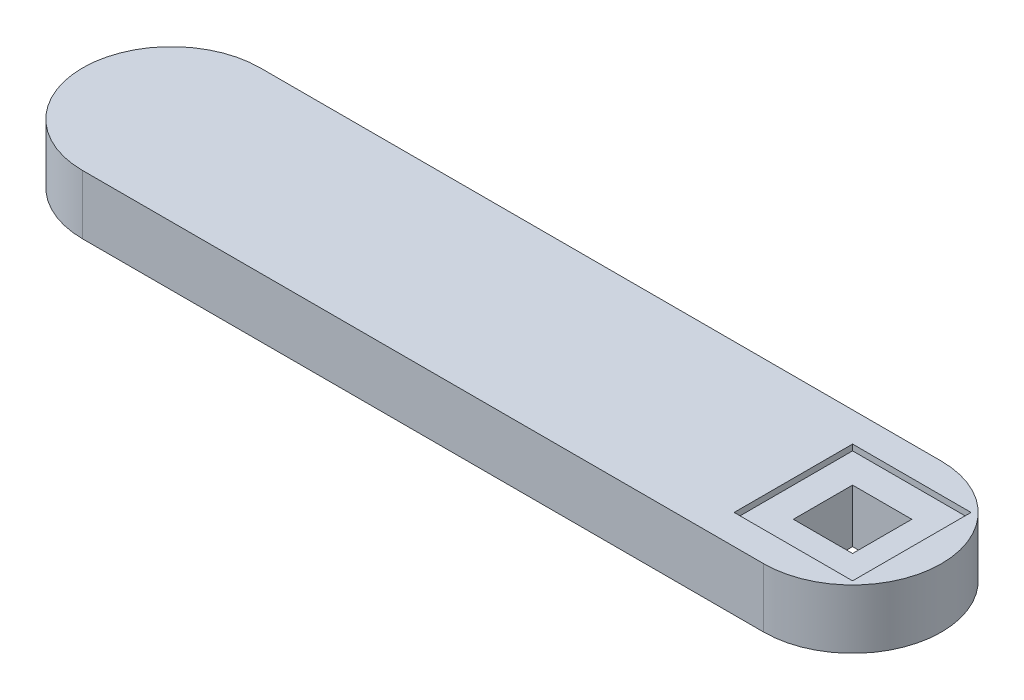
ISO-10303-21;
HEADER;
FILE_DESCRIPTION(('STEP AP214'),'2;1');
FILE_NAME('part.step','',(''),(''),'','','');
FILE_SCHEMA(('AUTOMOTIVE_DESIGN { 1 0 10303 214 1 1 1 1 }'));
ENDSEC;
DATA;
#1=APPLICATION_CONTEXT('core data for automotive mechanical design processes');
#2=APPLICATION_PROTOCOL_DEFINITION('international standard','automotive_design',2000,#1);
#3=PRODUCT_CONTEXT('',#1,'mechanical');
#4=PRODUCT('Part','Part','',(#3));
#5=PRODUCT_RELATED_PRODUCT_CATEGORY('part','',(#4));
#6=PRODUCT_DEFINITION_FORMATION('','',#4);
#7=PRODUCT_DEFINITION_CONTEXT('part definition',#1,'design');
#8=PRODUCT_DEFINITION('design','',#6,#7);
#9=PRODUCT_DEFINITION_SHAPE('','',#8);
#10=(LENGTH_UNIT() NAMED_UNIT(*) SI_UNIT(.MILLI.,.METRE.));
#11=(NAMED_UNIT(*) PLANE_ANGLE_UNIT() SI_UNIT($,.RADIAN.));
#12=(NAMED_UNIT(*) SI_UNIT($,.STERADIAN.) SOLID_ANGLE_UNIT());
#13=UNCERTAINTY_MEASURE_WITH_UNIT(LENGTH_MEASURE(1.E-05),#10,'distance_accuracy_value','');
#14=(GEOMETRIC_REPRESENTATION_CONTEXT(3) GLOBAL_UNCERTAINTY_ASSIGNED_CONTEXT((#13)) GLOBAL_UNIT_ASSIGNED_CONTEXT((#10,
#11,#12)) REPRESENTATION_CONTEXT('',''));
#15=CARTESIAN_POINT('',(0.,0.,0.));
#16=DIRECTION('',(0.,0.,1.));
#17=DIRECTION('',(1.,0.,0.));
#18=AXIS2_PLACEMENT_3D('',#15,#16,#17);
#19=CARTESIAN_POINT('',(1200.,0.,-50.));
#20=DIRECTION('',(1.,0.,0.));
#21=DIRECTION('',(0.,0.,-1.));
#22=AXIS2_PLACEMENT_3D('',#19,#20,#21);
#23=PLANE('',#22);
#24=DIRECTION('',(0.,0.,1.));
#25=VECTOR('',#24,1.);
#26=CARTESIAN_POINT('',(1200.,90.,-50.));
#27=LINE('',#26,#25);
#28=CARTESIAN_POINT('',(1200.,90.,-50.));
#29=VERTEX_POINT('',#28);
#30=CARTESIAN_POINT('',(1200.,90.,50.));
#31=VERTEX_POINT('',#30);
#32=EDGE_CURVE('E163',#29,#31,#27,.T.);
#33=ORIENTED_EDGE('',*,*,#32,.F.);
#34=DIRECTION('',(0.,1.,0.));
#35=VECTOR('',#34,1.);
#36=CARTESIAN_POINT('',(1200.,0.,-50.));
#37=LINE('',#36,#35);
#38=CARTESIAN_POINT('',(1200.,0.,-50.));
#39=VERTEX_POINT('',#38);
#40=EDGE_CURVE('E177',#39,#29,#37,.T.);
#41=ORIENTED_EDGE('',*,*,#40,.F.);
#42=DIRECTION('',(0.,0.,-1.));
#43=VECTOR('',#42,1.);
#44=CARTESIAN_POINT('',(1200.,0.,-50.));
#45=LINE('',#44,#43);
#46=CARTESIAN_POINT('',(1200.,0.,50.));
#47=VERTEX_POINT('',#46);
#48=EDGE_CURVE('E165',#47,#39,#45,.T.);
#49=ORIENTED_EDGE('',*,*,#48,.F.);
#50=DIRECTION('',(0.,1.,0.));
#51=VECTOR('',#50,1.);
#52=CARTESIAN_POINT('',(1200.,0.,50.));
#53=LINE('',#52,#51);
#54=EDGE_CURVE('E178',#47,#31,#53,.T.);
#55=ORIENTED_EDGE('',*,*,#54,.T.);
#56=EDGE_LOOP('',(#33,#41,#49,#55));
#57=FACE_BOUND('',#56,.T.);
#58=ADVANCED_FACE('F34',(#57),#23,.F.);
#59=CARTESIAN_POINT('',(1100.,0.,50.));
#60=DIRECTION('',(0.,0.,1.));
#61=DIRECTION('',(1.,0.,0.));
#62=AXIS2_PLACEMENT_3D('',#59,#60,#61);
#63=PLANE('',#62);
#64=DIRECTION('',(-1.,0.,0.));
#65=VECTOR('',#64,1.);
#66=CARTESIAN_POINT('',(1100.,90.,50.));
#67=LINE('',#66,#65);
#68=CARTESIAN_POINT('',(1100.,90.,50.));
#69=VERTEX_POINT('',#68);
#70=EDGE_CURVE('E161',#31,#69,#67,.T.);
#71=ORIENTED_EDGE('',*,*,#70,.F.);
#72=ORIENTED_EDGE('',*,*,#54,.F.);
#73=DIRECTION('',(1.,0.,0.));
#74=VECTOR('',#73,1.);
#75=CARTESIAN_POINT('',(1100.,0.,50.));
#76=LINE('',#75,#74);
#77=CARTESIAN_POINT('',(1100.,0.,50.));
#78=VERTEX_POINT('',#77);
#79=EDGE_CURVE('E174',#78,#47,#76,.T.);
#80=ORIENTED_EDGE('',*,*,#79,.F.);
#81=DIRECTION('',(0.,1.,0.));
#82=VECTOR('',#81,1.);
#83=CARTESIAN_POINT('',(1100.,0.,50.));
#84=LINE('',#83,#82);
#85=EDGE_CURVE('E182',#78,#69,#84,.T.);
#86=ORIENTED_EDGE('',*,*,#85,.T.);
#87=EDGE_LOOP('',(#71,#72,#80,#86));
#88=FACE_BOUND('',#87,.T.);
#89=ADVANCED_FACE('F261',(#88),#63,.F.);
#90=CARTESIAN_POINT('',(1100.,0.,-50.));
#91=DIRECTION('',(-1.,0.,0.));
#92=DIRECTION('',(0.,0.,1.));
#93=AXIS2_PLACEMENT_3D('',#90,#91,#92);
#94=PLANE('',#93);
#95=DIRECTION('',(0.,0.,-1.));
#96=VECTOR('',#95,1.);
#97=CARTESIAN_POINT('',(1100.,90.,-50.));
#98=LINE('',#97,#96);
#99=CARTESIAN_POINT('',(1100.,90.,-50.));
#100=VERTEX_POINT('',#99);
#101=EDGE_CURVE('E56',#69,#100,#98,.T.);
#102=ORIENTED_EDGE('',*,*,#101,.F.);
#103=ORIENTED_EDGE('',*,*,#85,.F.);
#104=DIRECTION('',(0.,0.,1.));
#105=VECTOR('',#104,1.);
#106=CARTESIAN_POINT('',(1100.,0.,-50.));
#107=LINE('',#106,#105);
#108=CARTESIAN_POINT('',(1100.,0.,-50.));
#109=VERTEX_POINT('',#108);
#110=EDGE_CURVE('E171',#109,#78,#107,.T.);
#111=ORIENTED_EDGE('',*,*,#110,.F.);
#112=DIRECTION('',(0.,1.,0.));
#113=VECTOR('',#112,1.);
#114=CARTESIAN_POINT('',(1100.,0.,-50.));
#115=LINE('',#114,#113);
#116=EDGE_CURVE('E185',#109,#100,#115,.T.);
#117=ORIENTED_EDGE('',*,*,#116,.T.);
#118=EDGE_LOOP('',(#102,#103,#111,#117));
#119=FACE_BOUND('',#118,.T.);
#120=ADVANCED_FACE('F268',(#119),#94,.F.);
#121=CARTESIAN_POINT('',(1100.,0.,-50.));
#122=DIRECTION('',(0.,0.,-1.));
#123=DIRECTION('',(-1.,0.,0.));
#124=AXIS2_PLACEMENT_3D('',#121,#122,#123);
#125=PLANE('',#124);
#126=DIRECTION('',(1.,0.,0.));
#127=VECTOR('',#126,1.);
#128=CARTESIAN_POINT('',(1100.,90.,-50.));
#129=LINE('',#128,#127);
#130=EDGE_CURVE('E11',#100,#29,#129,.T.);
#131=ORIENTED_EDGE('',*,*,#130,.F.);
#132=ORIENTED_EDGE('',*,*,#116,.F.);
#133=DIRECTION('',(-1.,0.,0.));
#134=VECTOR('',#133,1.);
#135=CARTESIAN_POINT('',(1100.,0.,-50.));
#136=LINE('',#135,#134);
#137=EDGE_CURVE('E168',#39,#109,#136,.T.);
#138=ORIENTED_EDGE('',*,*,#137,.F.);
#139=ORIENTED_EDGE('',*,*,#40,.T.);
#140=EDGE_LOOP('',(#131,#132,#138,#139));
#141=FACE_BOUND('',#140,.T.);
#142=ADVANCED_FACE('F274',(#141),#125,.F.);
#143=CARTESIAN_POINT('',(0.,100.,0.));
#144=DIRECTION('',(0.,-1.,0.));
#145=DIRECTION('',(0.,0.,-1.));
#146=AXIS2_PLACEMENT_3D('',#143,#144,#145);
#147=CYLINDRICAL_SURFACE('',#146,150.);
#148=CARTESIAN_POINT('',(0.,0.,0.));
#149=DIRECTION('',(0.,1.,0.));
#150=DIRECTION('',(0.,0.,1.));
#151=AXIS2_PLACEMENT_3D('',#148,#149,#150);
#152=CIRCLE('',#151,150.);
#153=CARTESIAN_POINT('',(0.,0.,-150.));
#154=VERTEX_POINT('',#153);
#155=CARTESIAN_POINT('',(0.,0.,150.));
#156=VERTEX_POINT('',#155);
#157=EDGE_CURVE('E192',#154,#156,#152,.T.);
#158=ORIENTED_EDGE('',*,*,#157,.T.);
#159=DIRECTION('',(0.,-1.,0.));
#160=VECTOR('',#159,1.);
#161=CARTESIAN_POINT('',(0.,100.,150.));
#162=LINE('',#161,#160);
#163=CARTESIAN_POINT('',(0.,100.,150.));
#164=VERTEX_POINT('',#163);
#165=EDGE_CURVE('E219',#164,#156,#162,.T.);
#166=ORIENTED_EDGE('',*,*,#165,.F.);
#167=CARTESIAN_POINT('',(0.,100.,0.));
#168=DIRECTION('',(0.,1.,0.));
#169=DIRECTION('',(0.,0.,1.));
#170=AXIS2_PLACEMENT_3D('',#167,#168,#169);
#171=CIRCLE('',#170,150.);
#172=CARTESIAN_POINT('',(0.,100.,-150.));
#173=VERTEX_POINT('',#172);
#174=EDGE_CURVE('E193',#173,#164,#171,.T.);
#175=ORIENTED_EDGE('',*,*,#174,.F.);
#176=DIRECTION('',(0.,-1.,0.));
#177=VECTOR('',#176,1.);
#178=CARTESIAN_POINT('',(0.,100.,-150.));
#179=LINE('',#178,#177);
#180=EDGE_CURVE('E203',#173,#154,#179,.T.);
#181=ORIENTED_EDGE('',*,*,#180,.T.);
#182=EDGE_LOOP('',(#158,#166,#175,#181));
#183=FACE_BOUND('',#182,.T.);
#184=ADVANCED_FACE('F36',(#183),#147,.T.);
#185=CARTESIAN_POINT('',(0.,100.,150.));
#186=DIRECTION('',(0.,0.,-1.));
#187=DIRECTION('',(-1.,0.,0.));
#188=AXIS2_PLACEMENT_3D('',#185,#186,#187);
#189=PLANE('',#188);
#190=DIRECTION('',(1.,0.,0.));
#191=VECTOR('',#190,1.);
#192=CARTESIAN_POINT('',(0.,0.,150.));
#193=LINE('',#192,#191);
#194=CARTESIAN_POINT('',(1150.,0.,150.));
#195=VERTEX_POINT('',#194);
#196=EDGE_CURVE('E206',#156,#195,#193,.T.);
#197=ORIENTED_EDGE('',*,*,#196,.T.);
#198=DIRECTION('',(0.,-1.,0.));
#199=VECTOR('',#198,1.);
#200=CARTESIAN_POINT('',(1150.,100.,150.));
#201=LINE('',#200,#199);
#202=CARTESIAN_POINT('',(1150.,100.,150.));
#203=VERTEX_POINT('',#202);
#204=EDGE_CURVE('E216',#203,#195,#201,.T.);
#205=ORIENTED_EDGE('',*,*,#204,.F.);
#206=DIRECTION('',(1.,0.,0.));
#207=VECTOR('',#206,1.);
#208=CARTESIAN_POINT('',(0.,100.,150.));
#209=LINE('',#208,#207);
#210=EDGE_CURVE('E196',#164,#203,#209,.T.);
#211=ORIENTED_EDGE('',*,*,#210,.F.);
#212=ORIENTED_EDGE('',*,*,#165,.T.);
#213=EDGE_LOOP('',(#197,#205,#211,#212));
#214=FACE_BOUND('',#213,.T.);
#215=ADVANCED_FACE('F248',(#214),#189,.F.);
#216=CARTESIAN_POINT('',(1150.,100.,0.));
#217=DIRECTION('',(0.,-1.,0.));
#218=DIRECTION('',(0.,0.,-1.));
#219=AXIS2_PLACEMENT_3D('',#216,#217,#218);
#220=CYLINDRICAL_SURFACE('',#219,150.);
#221=CARTESIAN_POINT('',(1150.,0.,0.));
#222=DIRECTION('',(0.,1.,0.));
#223=DIRECTION('',(0.,0.,1.));
#224=AXIS2_PLACEMENT_3D('',#221,#222,#223);
#225=CIRCLE('',#224,150.);
#226=CARTESIAN_POINT('',(1150.,0.,-150.));
#227=VERTEX_POINT('',#226);
#228=EDGE_CURVE('E208',#195,#227,#225,.T.);
#229=ORIENTED_EDGE('',*,*,#228,.T.);
#230=DIRECTION('',(0.,-1.,0.));
#231=VECTOR('',#230,1.);
#232=CARTESIAN_POINT('',(1150.,100.,-150.));
#233=LINE('',#232,#231);
#234=CARTESIAN_POINT('',(1150.,100.,-150.));
#235=VERTEX_POINT('',#234);
#236=EDGE_CURVE('E213',#235,#227,#233,.T.);
#237=ORIENTED_EDGE('',*,*,#236,.F.);
#238=CARTESIAN_POINT('',(1150.,100.,0.));
#239=DIRECTION('',(0.,1.,0.));
#240=DIRECTION('',(0.,0.,1.));
#241=AXIS2_PLACEMENT_3D('',#238,#239,#240);
#242=CIRCLE('',#241,150.);
#243=EDGE_CURVE('E199',#203,#235,#242,.T.);
#244=ORIENTED_EDGE('',*,*,#243,.F.);
#245=ORIENTED_EDGE('',*,*,#204,.T.);
#246=EDGE_LOOP('',(#229,#237,#244,#245));
#247=FACE_BOUND('',#246,.T.);
#248=ADVANCED_FACE('F245',(#247),#220,.T.);
#249=CARTESIAN_POINT('',(0.,100.,-150.));
#250=DIRECTION('',(0.,0.,1.));
#251=DIRECTION('',(1.,0.,0.));
#252=AXIS2_PLACEMENT_3D('',#249,#250,#251);
#253=PLANE('',#252);
#254=DIRECTION('',(-1.,0.,0.));
#255=VECTOR('',#254,1.);
#256=CARTESIAN_POINT('',(0.,0.,-150.));
#257=LINE('',#256,#255);
#258=EDGE_CURVE('E197',#227,#154,#257,.T.);
#259=ORIENTED_EDGE('',*,*,#258,.T.);
#260=ORIENTED_EDGE('',*,*,#180,.F.);
#261=DIRECTION('',(-1.,0.,0.));
#262=VECTOR('',#261,1.);
#263=CARTESIAN_POINT('',(0.,100.,-150.));
#264=LINE('',#263,#262);
#265=EDGE_CURVE('E201',#235,#173,#264,.T.);
#266=ORIENTED_EDGE('',*,*,#265,.F.);
#267=ORIENTED_EDGE('',*,*,#236,.T.);
#268=EDGE_LOOP('',(#259,#260,#266,#267));
#269=FACE_BOUND('',#268,.T.);
#270=ADVANCED_FACE('F241',(#269),#253,.F.);
#271=CARTESIAN_POINT('',(0.,100.,0.));
#272=DIRECTION('',(0.,1.,0.));
#273=DIRECTION('',(0.,0.,1.));
#274=AXIS2_PLACEMENT_3D('',#271,#272,#273);
#275=PLANE('',#274);
#276=DIRECTION('',(0.,0.,-1.));
#277=VECTOR('',#276,1.);
#278=CARTESIAN_POINT('',(1250.,100.,-99.9999999999999));
#279=LINE('',#278,#277);
#280=CARTESIAN_POINT('',(1250.,100.,100.));
#281=VERTEX_POINT('',#280);
#282=CARTESIAN_POINT('',(1250.,100.,-99.9999999999999));
#283=VERTEX_POINT('',#282);
#284=EDGE_CURVE('E49',#281,#283,#279,.T.);
#285=ORIENTED_EDGE('',*,*,#284,.F.);
#286=DIRECTION('',(1.,0.,0.));
#287=VECTOR('',#286,1.);
#288=CARTESIAN_POINT('',(1050.,100.,100.));
#289=LINE('',#288,#287);
#290=CARTESIAN_POINT('',(1050.,100.,100.));
#291=VERTEX_POINT('',#290);
#292=EDGE_CURVE('E142',#291,#281,#289,.T.);
#293=ORIENTED_EDGE('',*,*,#292,.F.);
#294=DIRECTION('',(0.,0.,1.));
#295=VECTOR('',#294,1.);
#296=CARTESIAN_POINT('',(1050.,100.,-99.9999999999999));
#297=LINE('',#296,#295);
#298=CARTESIAN_POINT('',(1050.,100.,-99.9999999999999));
#299=VERTEX_POINT('',#298);
#300=EDGE_CURVE('E145',#299,#291,#297,.T.);
#301=ORIENTED_EDGE('',*,*,#300,.F.);
#302=DIRECTION('',(-1.,0.,0.));
#303=VECTOR('',#302,1.);
#304=CARTESIAN_POINT('',(1050.,100.,-99.9999999999999));
#305=LINE('',#304,#303);
#306=EDGE_CURVE('E151',#283,#299,#305,.T.);
#307=ORIENTED_EDGE('',*,*,#306,.F.);
#308=EDGE_LOOP('',(#285,#293,#301,#307));
#309=FACE_BOUND('',#308,.T.);
#310=ORIENTED_EDGE('',*,*,#174,.T.);
#311=ORIENTED_EDGE('',*,*,#210,.T.);
#312=ORIENTED_EDGE('',*,*,#243,.T.);
#313=ORIENTED_EDGE('',*,*,#265,.T.);
#314=EDGE_LOOP('',(#310,#311,#312,#313));
#315=FACE_BOUND('',#314,.T.);
#316=ADVANCED_FACE('F229',(#309,#315),#275,.T.);
#317=CARTESIAN_POINT('',(0.,0.,0.));
#318=DIRECTION('',(0.,1.,0.));
#319=DIRECTION('',(0.,0.,1.));
#320=AXIS2_PLACEMENT_3D('',#317,#318,#319);
#321=PLANE('',#320);
#322=ORIENTED_EDGE('',*,*,#79,.T.);
#323=ORIENTED_EDGE('',*,*,#48,.T.);
#324=ORIENTED_EDGE('',*,*,#137,.T.);
#325=ORIENTED_EDGE('',*,*,#110,.T.);
#326=EDGE_LOOP('',(#322,#323,#324,#325));
#327=FACE_BOUND('',#326,.T.);
#328=CARTESIAN_POINT('',(0.,0.,0.));
#329=DIRECTION('',(0.,1.,0.));
#330=DIRECTION('',(0.,0.,1.));
#331=AXIS2_PLACEMENT_3D('',#328,#329,#330);
#332=CIRCLE('',#331,50.);
#333=CARTESIAN_POINT('',(0.,0.,50.));
#334=VERTEX_POINT('',#333);
#335=EDGE_CURVE('E42',#334,#334,#332,.F.);
#336=ORIENTED_EDGE('',*,*,#335,.F.);
#337=EDGE_LOOP('',(#336));
#338=FACE_BOUND('',#337,.T.);
#339=ORIENTED_EDGE('',*,*,#157,.F.);
#340=ORIENTED_EDGE('',*,*,#258,.F.);
#341=ORIENTED_EDGE('',*,*,#228,.F.);
#342=ORIENTED_EDGE('',*,*,#196,.F.);
#343=EDGE_LOOP('',(#339,#340,#341,#342));
#344=FACE_BOUND('',#343,.T.);
#345=ADVANCED_FACE('F226',(#327,#338,#344),#321,.F.);
#346=CARTESIAN_POINT('',(0.,-50.,0.));
#347=DIRECTION('',(0.,1.,0.));
#348=DIRECTION('',(0.,0.,1.));
#349=AXIS2_PLACEMENT_3D('',#346,#347,#348);
#350=CYLINDRICAL_SURFACE('',#349,50.);
#351=CARTESIAN_POINT('',(0.,-50.,0.));
#352=DIRECTION('',(0.,-1.,0.));
#353=DIRECTION('',(0.,0.,-1.));
#354=AXIS2_PLACEMENT_3D('',#351,#352,#353);
#355=CIRCLE('',#354,50.);
#356=CARTESIAN_POINT('',(0.,-50.,-50.));
#357=VERTEX_POINT('',#356);
#358=EDGE_CURVE('E181',#357,#357,#355,.T.);
#359=ORIENTED_EDGE('',*,*,#358,.F.);
#360=EDGE_LOOP('',(#359));
#361=FACE_BOUND('',#360,.T.);
#362=ORIENTED_EDGE('',*,*,#335,.T.);
#363=EDGE_LOOP('',(#362));
#364=FACE_BOUND('',#363,.T.);
#365=ADVANCED_FACE('F224',(#361,#364),#350,.T.);
#366=CARTESIAN_POINT('',(0.,-50.,0.));
#367=DIRECTION('',(0.,-1.,0.));
#368=DIRECTION('',(0.,0.,-1.));
#369=AXIS2_PLACEMENT_3D('',#366,#367,#368);
#370=PLANE('',#369);
#371=ORIENTED_EDGE('',*,*,#358,.T.);
#372=EDGE_LOOP('',(#371));
#373=FACE_BOUND('',#372,.T.);
#374=ADVANCED_FACE('F276',(#373),#370,.T.);
#375=CARTESIAN_POINT('',(0.,90.,0.));
#376=DIRECTION('',(0.,1.,0.));
#377=DIRECTION('',(0.,0.,1.));
#378=AXIS2_PLACEMENT_3D('',#375,#376,#377);
#379=PLANE('',#378);
#380=DIRECTION('',(0.,0.,-1.));
#381=VECTOR('',#380,1.);
#382=CARTESIAN_POINT('',(1250.,90.,-99.9999999999999));
#383=LINE('',#382,#381);
#384=CARTESIAN_POINT('',(1250.,90.,100.));
#385=VERTEX_POINT('',#384);
#386=CARTESIAN_POINT('',(1250.,90.,-99.9999999999999));
#387=VERTEX_POINT('',#386);
#388=EDGE_CURVE('E124',#385,#387,#383,.T.);
#389=ORIENTED_EDGE('',*,*,#388,.T.);
#390=DIRECTION('',(-1.,0.,0.));
#391=VECTOR('',#390,1.);
#392=CARTESIAN_POINT('',(1050.,90.,-99.9999999999999));
#393=LINE('',#392,#391);
#394=CARTESIAN_POINT('',(1050.,90.,-99.9999999999999));
#395=VERTEX_POINT('',#394);
#396=EDGE_CURVE('E133',#387,#395,#393,.T.);
#397=ORIENTED_EDGE('',*,*,#396,.T.);
#398=DIRECTION('',(0.,0.,1.));
#399=VECTOR('',#398,1.);
#400=CARTESIAN_POINT('',(1050.,90.,-99.9999999999999));
#401=LINE('',#400,#399);
#402=CARTESIAN_POINT('',(1050.,90.,100.));
#403=VERTEX_POINT('',#402);
#404=EDGE_CURVE('E138',#395,#403,#401,.T.);
#405=ORIENTED_EDGE('',*,*,#404,.T.);
#406=DIRECTION('',(1.,0.,0.));
#407=VECTOR('',#406,1.);
#408=CARTESIAN_POINT('',(1050.,90.,100.));
#409=LINE('',#408,#407);
#410=EDGE_CURVE('E130',#403,#385,#409,.T.);
#411=ORIENTED_EDGE('',*,*,#410,.T.);
#412=EDGE_LOOP('',(#389,#397,#405,#411));
#413=FACE_BOUND('',#412,.T.);
#414=ORIENTED_EDGE('',*,*,#32,.T.);
#415=ORIENTED_EDGE('',*,*,#70,.T.);
#416=ORIENTED_EDGE('',*,*,#101,.T.);
#417=ORIENTED_EDGE('',*,*,#130,.T.);
#418=EDGE_LOOP('',(#414,#415,#416,#417));
#419=FACE_BOUND('',#418,.T.);
#420=ADVANCED_FACE('F140',(#413,#419),#379,.T.);
#421=CARTESIAN_POINT('',(1250.,90.,-99.9999999999999));
#422=DIRECTION('',(1.,0.,0.));
#423=DIRECTION('',(0.,0.,-1.));
#424=AXIS2_PLACEMENT_3D('',#421,#422,#423);
#425=PLANE('',#424);
#426=ORIENTED_EDGE('',*,*,#284,.T.);
#427=DIRECTION('',(0.,1.,0.));
#428=VECTOR('',#427,1.);
#429=CARTESIAN_POINT('',(1250.,90.,-99.9999999999999));
#430=LINE('',#429,#428);
#431=EDGE_CURVE('E120',#387,#283,#430,.T.);
#432=ORIENTED_EDGE('',*,*,#431,.F.);
#433=ORIENTED_EDGE('',*,*,#388,.F.);
#434=DIRECTION('',(0.,1.,0.));
#435=VECTOR('',#434,1.);
#436=CARTESIAN_POINT('',(1250.,90.,100.));
#437=LINE('',#436,#435);
#438=EDGE_CURVE('E155',#385,#281,#437,.T.);
#439=ORIENTED_EDGE('',*,*,#438,.T.);
#440=EDGE_LOOP('',(#426,#432,#433,#439));
#441=FACE_BOUND('',#440,.T.);
#442=ADVANCED_FACE('F122',(#441),#425,.F.);
#443=CARTESIAN_POINT('',(1050.,90.,100.));
#444=DIRECTION('',(0.,0.,1.));
#445=DIRECTION('',(1.,0.,0.));
#446=AXIS2_PLACEMENT_3D('',#443,#444,#445);
#447=PLANE('',#446);
#448=ORIENTED_EDGE('',*,*,#292,.T.);
#449=ORIENTED_EDGE('',*,*,#438,.F.);
#450=ORIENTED_EDGE('',*,*,#410,.F.);
#451=DIRECTION('',(0.,1.,0.));
#452=VECTOR('',#451,1.);
#453=CARTESIAN_POINT('',(1050.,90.,100.));
#454=LINE('',#453,#452);
#455=EDGE_CURVE('E157',#403,#291,#454,.T.);
#456=ORIENTED_EDGE('',*,*,#455,.T.);
#457=EDGE_LOOP('',(#448,#449,#450,#456));
#458=FACE_BOUND('',#457,.T.);
#459=ADVANCED_FACE('F323',(#458),#447,.F.);
#460=CARTESIAN_POINT('',(1050.,90.,-99.9999999999999));
#461=DIRECTION('',(-1.,0.,0.));
#462=DIRECTION('',(0.,0.,1.));
#463=AXIS2_PLACEMENT_3D('',#460,#461,#462);
#464=PLANE('',#463);
#465=ORIENTED_EDGE('',*,*,#300,.T.);
#466=ORIENTED_EDGE('',*,*,#455,.F.);
#467=ORIENTED_EDGE('',*,*,#404,.F.);
#468=DIRECTION('',(0.,1.,0.));
#469=VECTOR('',#468,1.);
#470=CARTESIAN_POINT('',(1050.,90.,-99.9999999999999));
#471=LINE('',#470,#469);
#472=EDGE_CURVE('E129',#395,#299,#471,.T.);
#473=ORIENTED_EDGE('',*,*,#472,.T.);
#474=EDGE_LOOP('',(#465,#466,#467,#473));
#475=FACE_BOUND('',#474,.T.);
#476=ADVANCED_FACE('F330',(#475),#464,.F.);
#477=CARTESIAN_POINT('',(1050.,90.,-99.9999999999999));
#478=DIRECTION('',(0.,0.,-1.));
#479=DIRECTION('',(-1.,0.,0.));
#480=AXIS2_PLACEMENT_3D('',#477,#478,#479);
#481=PLANE('',#480);
#482=ORIENTED_EDGE('',*,*,#306,.T.);
#483=ORIENTED_EDGE('',*,*,#472,.F.);
#484=ORIENTED_EDGE('',*,*,#396,.F.);
#485=ORIENTED_EDGE('',*,*,#431,.T.);
#486=EDGE_LOOP('',(#482,#483,#484,#485));
#487=FACE_BOUND('',#486,.T.);
#488=ADVANCED_FACE('F134',(#487),#481,.F.);
#489=CLOSED_SHELL('',(#58,#89,#120,#142,#184,#215,#248,#270,#316,#345,#365,#374,#420,#442,#459,
#476,#488));
#490=MANIFOLD_SOLID_BREP('B2',#489);
#491=ADVANCED_BREP_SHAPE_REPRESENTATION('',(#18,#490),#14);
#492=SHAPE_DEFINITION_REPRESENTATION(#9,#491);
ENDSEC;
END-ISO-10303-21;
